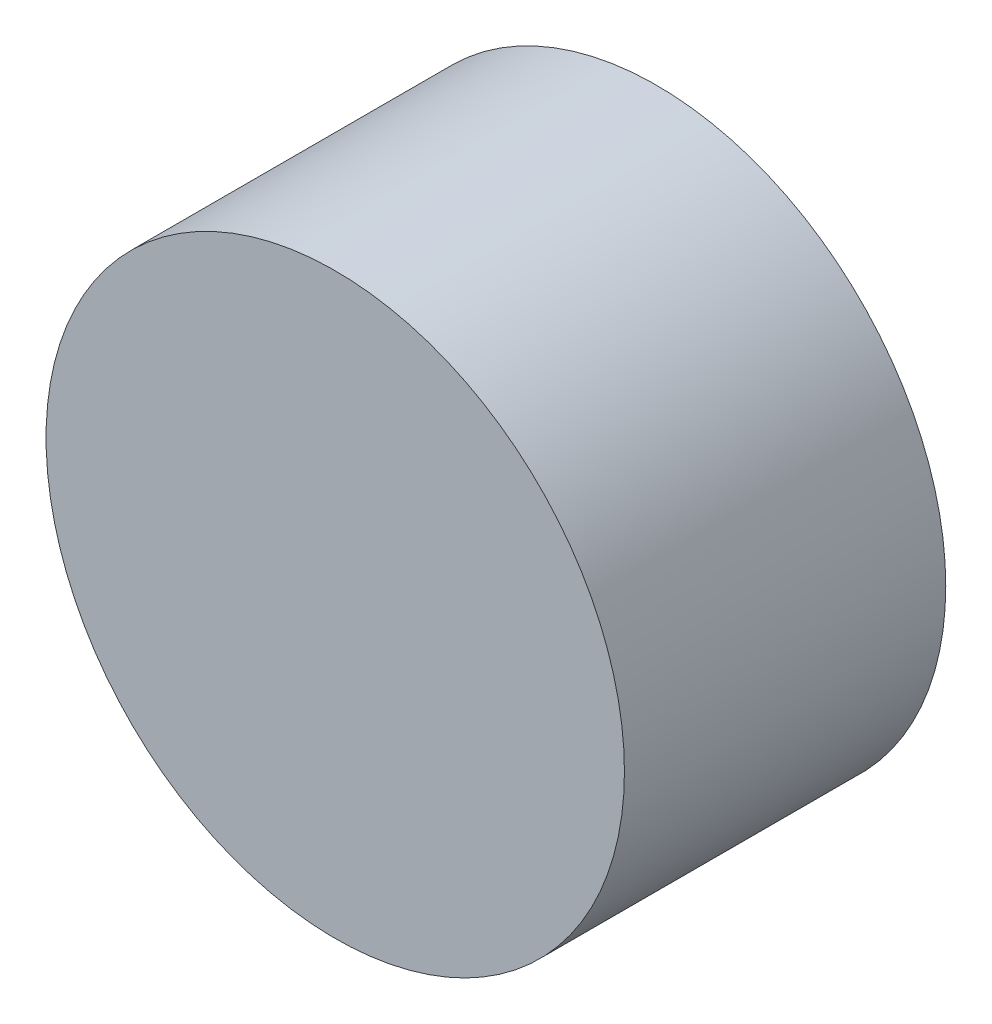
ISO-10303-21;
HEADER;
FILE_DESCRIPTION(('STEP AP214'),'2;1');
FILE_NAME('part.step','',(''),(''),'','','');
FILE_SCHEMA(('AUTOMOTIVE_DESIGN { 1 0 10303 214 1 1 1 1 }'));
ENDSEC;
DATA;
#1=APPLICATION_CONTEXT('core data for automotive mechanical design processes');
#2=APPLICATION_PROTOCOL_DEFINITION('international standard','automotive_design',2000,#1);
#3=PRODUCT_CONTEXT('',#1,'mechanical');
#4=PRODUCT('Part','Part','',(#3));
#5=PRODUCT_RELATED_PRODUCT_CATEGORY('part','',(#4));
#6=PRODUCT_DEFINITION_FORMATION('','',#4);
#7=PRODUCT_DEFINITION_CONTEXT('part definition',#1,'design');
#8=PRODUCT_DEFINITION('design','',#6,#7);
#9=PRODUCT_DEFINITION_SHAPE('','',#8);
#10=(LENGTH_UNIT() NAMED_UNIT(*) SI_UNIT(.MILLI.,.METRE.));
#11=(NAMED_UNIT(*) PLANE_ANGLE_UNIT() SI_UNIT($,.RADIAN.));
#12=(NAMED_UNIT(*) SI_UNIT($,.STERADIAN.) SOLID_ANGLE_UNIT());
#13=UNCERTAINTY_MEASURE_WITH_UNIT(LENGTH_MEASURE(1.E-05),#10,'distance_accuracy_value','');
#14=(GEOMETRIC_REPRESENTATION_CONTEXT(3) GLOBAL_UNCERTAINTY_ASSIGNED_CONTEXT((#13)) GLOBAL_UNIT_ASSIGNED_CONTEXT((#10,
#11,#12)) REPRESENTATION_CONTEXT('',''));
#15=CARTESIAN_POINT('',(0.,0.,0.));
#16=DIRECTION('',(0.,0.,1.));
#17=DIRECTION('',(1.,0.,0.));
#18=AXIS2_PLACEMENT_3D('',#15,#16,#17);
#19=CARTESIAN_POINT('',(0.,0.,4.));
#20=DIRECTION('',(0.,0.,-1.));
#21=DIRECTION('',(-1.,0.,0.));
#22=AXIS2_PLACEMENT_3D('',#19,#20,#21);
#23=CYLINDRICAL_SURFACE('',#22,3.6);
#24=CARTESIAN_POINT('',(0.,0.,4.));
#25=DIRECTION('',(0.,0.,1.));
#26=DIRECTION('',(1.,0.,0.));
#27=AXIS2_PLACEMENT_3D('',#24,#25,#26);
#28=CIRCLE('',#27,3.6);
#29=CARTESIAN_POINT('',(3.6,0.,4.));
#30=VERTEX_POINT('',#29);
#31=EDGE_CURVE('E10',#30,#30,#28,.T.);
#32=ORIENTED_EDGE('',*,*,#31,.F.);
#33=EDGE_LOOP('',(#32));
#34=FACE_BOUND('',#33,.T.);
#35=CARTESIAN_POINT('',(0.,0.,0.));
#36=DIRECTION('',(0.,0.,1.));
#37=DIRECTION('',(1.,0.,0.));
#38=AXIS2_PLACEMENT_3D('',#35,#36,#37);
#39=CIRCLE('',#38,3.6);
#40=CARTESIAN_POINT('',(3.6,0.,0.));
#41=VERTEX_POINT('',#40);
#42=EDGE_CURVE('E46',#41,#41,#39,.T.);
#43=ORIENTED_EDGE('',*,*,#42,.T.);
#44=EDGE_LOOP('',(#43));
#45=FACE_BOUND('',#44,.T.);
#46=ADVANCED_FACE('F43',(#34,#45),#23,.T.);
#47=CARTESIAN_POINT('',(0.,0.,4.));
#48=DIRECTION('',(0.,0.,1.));
#49=DIRECTION('',(1.,0.,0.));
#50=AXIS2_PLACEMENT_3D('',#47,#48,#49);
#51=PLANE('',#50);
#52=ORIENTED_EDGE('',*,*,#31,.T.);
#53=EDGE_LOOP('',(#52));
#54=FACE_BOUND('',#53,.T.);
#55=ADVANCED_FACE('F60',(#54),#51,.T.);
#56=CARTESIAN_POINT('',(0.,0.,0.));
#57=DIRECTION('',(0.,0.,1.));
#58=DIRECTION('',(1.,0.,0.));
#59=AXIS2_PLACEMENT_3D('',#56,#57,#58);
#60=PLANE('',#59);
#61=ORIENTED_EDGE('',*,*,#42,.F.);
#62=EDGE_LOOP('',(#61));
#63=FACE_BOUND('',#62,.T.);
#64=ADVANCED_FACE('F58',(#63),#60,.F.);
#65=CLOSED_SHELL('',(#46,#55,#64));
#66=MANIFOLD_SOLID_BREP('B2',#65);
#67=ADVANCED_BREP_SHAPE_REPRESENTATION('',(#18,#66),#14);
#68=SHAPE_DEFINITION_REPRESENTATION(#9,#67);
ENDSEC;
END-ISO-10303-21;
